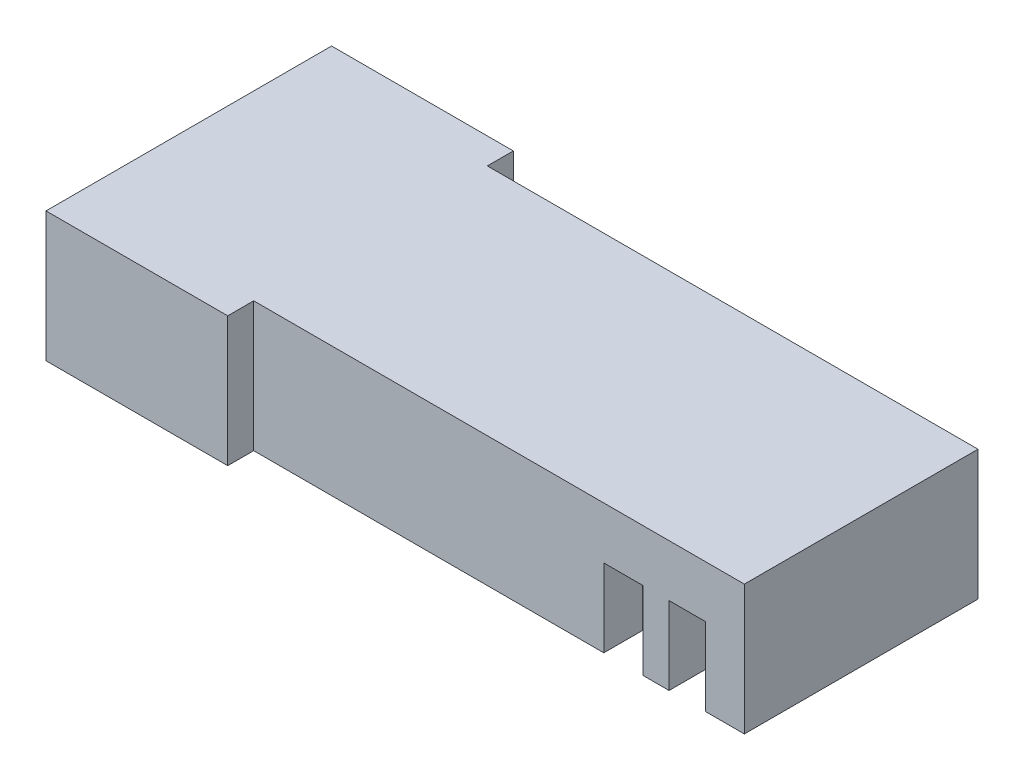
ISO-10303-21;
HEADER;
FILE_DESCRIPTION(('STEP AP214'),'2;1');
FILE_NAME('part.step','',(''),(''),'','','');
FILE_SCHEMA(('AUTOMOTIVE_DESIGN { 1 0 10303 214 1 1 1 1 }'));
ENDSEC;
DATA;
#1=APPLICATION_CONTEXT('core data for automotive mechanical design processes');
#2=APPLICATION_PROTOCOL_DEFINITION('international standard','automotive_design',2000,#1);
#3=PRODUCT_CONTEXT('',#1,'mechanical');
#4=PRODUCT('Part','Part','',(#3));
#5=PRODUCT_RELATED_PRODUCT_CATEGORY('part','',(#4));
#6=PRODUCT_DEFINITION_FORMATION('','',#4);
#7=PRODUCT_DEFINITION_CONTEXT('part definition',#1,'design');
#8=PRODUCT_DEFINITION('design','',#6,#7);
#9=PRODUCT_DEFINITION_SHAPE('','',#8);
#10=(LENGTH_UNIT() NAMED_UNIT(*) SI_UNIT(.MILLI.,.METRE.));
#11=(NAMED_UNIT(*) PLANE_ANGLE_UNIT() SI_UNIT($,.RADIAN.));
#12=(NAMED_UNIT(*) SI_UNIT($,.STERADIAN.) SOLID_ANGLE_UNIT());
#13=UNCERTAINTY_MEASURE_WITH_UNIT(LENGTH_MEASURE(1.E-05),#10,'distance_accuracy_value','');
#14=(GEOMETRIC_REPRESENTATION_CONTEXT(3) GLOBAL_UNCERTAINTY_ASSIGNED_CONTEXT((#13)) GLOBAL_UNIT_ASSIGNED_CONTEXT((#10,
#11,#12)) REPRESENTATION_CONTEXT('',''));
#15=CARTESIAN_POINT('',(0.,0.,0.));
#16=DIRECTION('',(0.,0.,1.));
#17=DIRECTION('',(1.,0.,0.));
#18=AXIS2_PLACEMENT_3D('',#15,#16,#17);
#19=CARTESIAN_POINT('',(0.,0.,0.));
#20=DIRECTION('',(0.,-1.,0.));
#21=DIRECTION('',(0.,0.,-1.));
#22=AXIS2_PLACEMENT_3D('',#19,#20,#21);
#23=PLANE('',#22);
#24=DIRECTION('',(0.,0.,-1.));
#25=VECTOR('',#24,1.);
#26=CARTESIAN_POINT('',(8.5,0.,-1.6));
#27=LINE('',#26,#25);
#28=CARTESIAN_POINT('',(8.5,0.,4.5));
#29=VERTEX_POINT('',#28);
#30=CARTESIAN_POINT('',(8.5,0.,-1.6));
#31=VERTEX_POINT('',#30);
#32=EDGE_CURVE('E312',#29,#31,#27,.T.);
#33=ORIENTED_EDGE('',*,*,#32,.T.);
#34=DIRECTION('',(-1.,0.,0.));
#35=VECTOR('',#34,1.);
#36=CARTESIAN_POINT('',(0.5,0.,-1.6));
#37=LINE('',#36,#35);
#38=CARTESIAN_POINT('',(0.5,0.,-1.6));
#39=VERTEX_POINT('',#38);
#40=EDGE_CURVE('E289',#31,#39,#37,.T.);
#41=ORIENTED_EDGE('',*,*,#40,.T.);
#42=DIRECTION('',(0.,0.,1.));
#43=VECTOR('',#42,1.);
#44=CARTESIAN_POINT('',(0.5,0.,1.6));
#45=LINE('',#44,#43);
#46=CARTESIAN_POINT('',(0.5,0.,1.6));
#47=VERTEX_POINT('',#46);
#48=EDGE_CURVE('E284',#39,#47,#45,.T.);
#49=ORIENTED_EDGE('',*,*,#48,.T.);
#50=DIRECTION('',(1.,0.,0.));
#51=VECTOR('',#50,1.);
#52=CARTESIAN_POINT('',(7.5,0.,1.6));
#53=LINE('',#52,#51);
#54=CARTESIAN_POINT('',(7.5,0.,1.6));
#55=VERTEX_POINT('',#54);
#56=EDGE_CURVE('E306',#47,#55,#53,.T.);
#57=ORIENTED_EDGE('',*,*,#56,.T.);
#58=DIRECTION('',(0.,0.,1.));
#59=VECTOR('',#58,1.);
#60=CARTESIAN_POINT('',(7.5,0.,4.5));
#61=LINE('',#60,#59);
#62=CARTESIAN_POINT('',(7.5,0.,4.5));
#63=VERTEX_POINT('',#62);
#64=EDGE_CURVE('E309',#55,#63,#61,.T.);
#65=ORIENTED_EDGE('',*,*,#64,.T.);
#66=DIRECTION('',(1.,0.,0.));
#67=VECTOR('',#66,1.);
#68=CARTESIAN_POINT('',(11.4,0.,4.5));
#69=LINE('',#68,#67);
#70=CARTESIAN_POINT('',(5.98615735461801,0.,4.5));
#71=VERTEX_POINT('',#70);
#72=EDGE_CURVE('E430',#71,#63,#69,.T.);
#73=ORIENTED_EDGE('',*,*,#72,.F.);
#74=DIRECTION('',(0.,0.,-1.));
#75=VECTOR('',#74,1.);
#76=CARTESIAN_POINT('',(5.98615735461801,0.,4.5));
#77=LINE('',#76,#75);
#78=CARTESIAN_POINT('',(5.98615735461801,0.,3.));
#79=VERTEX_POINT('',#78);
#80=EDGE_CURVE('E319',#71,#79,#77,.T.);
#81=ORIENTED_EDGE('',*,*,#80,.T.);
#82=DIRECTION('',(-1.,0.,0.));
#83=VECTOR('',#82,1.);
#84=CARTESIAN_POINT('',(5.98615735461801,0.,3.));
#85=LINE('',#84,#83);
#86=CARTESIAN_POINT('',(0.5,0.,3.));
#87=VERTEX_POINT('',#86);
#88=EDGE_CURVE('E358',#79,#87,#85,.T.);
#89=ORIENTED_EDGE('',*,*,#88,.T.);
#90=DIRECTION('',(0.,0.,1.));
#91=VECTOR('',#90,1.);
#92=CARTESIAN_POINT('',(0.5,0.,3.5));
#93=LINE('',#92,#91);
#94=CARTESIAN_POINT('',(0.5,0.,3.5));
#95=VERTEX_POINT('',#94);
#96=EDGE_CURVE('E361',#87,#95,#93,.T.);
#97=ORIENTED_EDGE('',*,*,#96,.T.);
#98=DIRECTION('',(-1.,0.,0.));
#99=VECTOR('',#98,1.);
#100=CARTESIAN_POINT('',(-14.5,0.,3.5));
#101=LINE('',#100,#99);
#102=CARTESIAN_POINT('',(-14.5,0.,3.5));
#103=VERTEX_POINT('',#102);
#104=EDGE_CURVE('E335',#95,#103,#101,.T.);
#105=ORIENTED_EDGE('',*,*,#104,.T.);
#106=DIRECTION('',(0.,0.,1.));
#107=VECTOR('',#106,1.);
#108=CARTESIAN_POINT('',(-14.5,0.,-5.5));
#109=LINE('',#108,#107);
#110=CARTESIAN_POINT('',(-14.5,0.,-3.5));
#111=VERTEX_POINT('',#110);
#112=EDGE_CURVE('E418',#111,#103,#109,.T.);
#113=ORIENTED_EDGE('',*,*,#112,.F.);
#114=DIRECTION('',(1.,0.,0.));
#115=VECTOR('',#114,1.);
#116=CARTESIAN_POINT('',(-14.5,0.,-3.5));
#117=LINE('',#116,#115);
#118=CARTESIAN_POINT('',(0.499999999999999,0.,-3.5));
#119=VERTEX_POINT('',#118);
#120=EDGE_CURVE('E369',#111,#119,#117,.T.);
#121=ORIENTED_EDGE('',*,*,#120,.T.);
#122=DIRECTION('',(0.,0.,1.));
#123=VECTOR('',#122,1.);
#124=CARTESIAN_POINT('',(0.499999999999999,0.,-3.5));
#125=LINE('',#124,#123);
#126=CARTESIAN_POINT('',(0.5,0.,-3.));
#127=VERTEX_POINT('',#126);
#128=EDGE_CURVE('E407',#119,#127,#125,.T.);
#129=ORIENTED_EDGE('',*,*,#128,.T.);
#130=DIRECTION('',(1.,0.,0.));
#131=VECTOR('',#130,1.);
#132=CARTESIAN_POINT('',(7.5,0.,-3.));
#133=LINE('',#132,#131);
#134=CARTESIAN_POINT('',(9.9,0.,-3.));
#135=VERTEX_POINT('',#134);
#136=EDGE_CURVE('E410',#127,#135,#133,.T.);
#137=ORIENTED_EDGE('',*,*,#136,.T.);
#138=DIRECTION('',(0.,0.,1.));
#139=VECTOR('',#138,1.);
#140=CARTESIAN_POINT('',(9.9,0.,-3.));
#141=LINE('',#140,#139);
#142=CARTESIAN_POINT('',(9.9,0.,4.5));
#143=VERTEX_POINT('',#142);
#144=EDGE_CURVE('E381',#135,#143,#141,.T.);
#145=ORIENTED_EDGE('',*,*,#144,.T.);
#146=EDGE_CURVE('E447',#29,#143,#69,.T.);
#147=ORIENTED_EDGE('',*,*,#146,.F.);
#148=EDGE_LOOP('',(#33,#41,#49,#57,#65,#73,#81,#89,#97,#105,#113,#121,#129,#137,#145,#147));
#149=FACE_BOUND('',#148,.T.);
#150=ADVANCED_FACE('F37',(#149),#23,.T.);
#151=CARTESIAN_POINT('',(-7.5,2.,-4.5));
#152=DIRECTION('',(0.,0.,1.));
#153=DIRECTION('',(1.,0.,0.));
#154=AXIS2_PLACEMENT_3D('',#151,#152,#153);
#155=PLANE('',#154);
#156=DIRECTION('',(0.,-1.,0.));
#157=VECTOR('',#156,1.);
#158=CARTESIAN_POINT('',(11.4,2.,-4.5));
#159=LINE('',#158,#157);
#160=CARTESIAN_POINT('',(11.4,2.,-4.5));
#161=VERTEX_POINT('',#160);
#162=CARTESIAN_POINT('',(11.4,-3.,-4.5));
#163=VERTEX_POINT('',#162);
#164=EDGE_CURVE('E444',#161,#163,#159,.T.);
#165=ORIENTED_EDGE('',*,*,#164,.T.);
#166=DIRECTION('',(-1.,0.,0.));
#167=VECTOR('',#166,1.);
#168=CARTESIAN_POINT('',(11.4,-3.,-4.5));
#169=LINE('',#168,#167);
#170=CARTESIAN_POINT('',(-7.5,-3.,-4.5));
#171=VERTEX_POINT('',#170);
#172=EDGE_CURVE('E377',#163,#171,#169,.T.);
#173=ORIENTED_EDGE('',*,*,#172,.T.);
#174=DIRECTION('',(0.,-1.,0.));
#175=VECTOR('',#174,1.);
#176=CARTESIAN_POINT('',(-7.5,2.,-4.5));
#177=LINE('',#176,#175);
#178=CARTESIAN_POINT('',(-7.5,2.,-4.5));
#179=VERTEX_POINT('',#178);
#180=EDGE_CURVE('E463',#179,#171,#177,.T.);
#181=ORIENTED_EDGE('',*,*,#180,.F.);
#182=DIRECTION('',(-1.,0.,0.));
#183=VECTOR('',#182,1.);
#184=CARTESIAN_POINT('',(7.5,2.,-4.5));
#185=LINE('',#184,#183);
#186=EDGE_CURVE('E427',#161,#179,#185,.T.);
#187=ORIENTED_EDGE('',*,*,#186,.F.);
#188=EDGE_LOOP('',(#165,#173,#181,#187));
#189=FACE_BOUND('',#188,.T.);
#190=ADVANCED_FACE('F39',(#189),#155,.F.);
#191=CARTESIAN_POINT('',(-7.5,2.,-4.5));
#192=DIRECTION('',(-1.,0.,0.));
#193=DIRECTION('',(0.,0.,1.));
#194=AXIS2_PLACEMENT_3D('',#191,#192,#193);
#195=PLANE('',#194);
#196=DIRECTION('',(0.,0.,-1.));
#197=VECTOR('',#196,1.);
#198=CARTESIAN_POINT('',(-7.5,-3.,-4.5));
#199=LINE('',#198,#197);
#200=CARTESIAN_POINT('',(-7.5,-3.,-5.5));
#201=VERTEX_POINT('',#200);
#202=EDGE_CURVE('E380',#171,#201,#199,.T.);
#203=ORIENTED_EDGE('',*,*,#202,.T.);
#204=DIRECTION('',(0.,-1.,0.));
#205=VECTOR('',#204,1.);
#206=CARTESIAN_POINT('',(-7.5,2.,-5.5));
#207=LINE('',#206,#205);
#208=CARTESIAN_POINT('',(-7.5,2.,-5.5));
#209=VERTEX_POINT('',#208);
#210=EDGE_CURVE('E461',#209,#201,#207,.T.);
#211=ORIENTED_EDGE('',*,*,#210,.F.);
#212=DIRECTION('',(0.,0.,-1.));
#213=VECTOR('',#212,1.);
#214=CARTESIAN_POINT('',(-7.5,2.,-4.5));
#215=LINE('',#214,#213);
#216=EDGE_CURVE('E429',#179,#209,#215,.T.);
#217=ORIENTED_EDGE('',*,*,#216,.F.);
#218=ORIENTED_EDGE('',*,*,#180,.T.);
#219=EDGE_LOOP('',(#203,#211,#217,#218));
#220=FACE_BOUND('',#219,.T.);
#221=ADVANCED_FACE('F509',(#220),#195,.F.);
#222=CARTESIAN_POINT('',(-7.5,2.,-5.5));
#223=DIRECTION('',(0.,0.,1.));
#224=DIRECTION('',(1.,0.,0.));
#225=AXIS2_PLACEMENT_3D('',#222,#223,#224);
#226=PLANE('',#225);
#227=DIRECTION('',(-1.,0.,0.));
#228=VECTOR('',#227,1.);
#229=CARTESIAN_POINT('',(-7.5,-3.,-5.5));
#230=LINE('',#229,#228);
#231=CARTESIAN_POINT('',(-14.5,-3.,-5.5));
#232=VERTEX_POINT('',#231);
#233=EDGE_CURVE('E384',#201,#232,#230,.T.);
#234=ORIENTED_EDGE('',*,*,#233,.T.);
#235=DIRECTION('',(0.,-1.,0.));
#236=VECTOR('',#235,1.);
#237=CARTESIAN_POINT('',(-14.5,2.,-5.5));
#238=LINE('',#237,#236);
#239=CARTESIAN_POINT('',(-14.5,2.,-5.5));
#240=VERTEX_POINT('',#239);
#241=EDGE_CURVE('E459',#240,#232,#238,.T.);
#242=ORIENTED_EDGE('',*,*,#241,.F.);
#243=DIRECTION('',(-1.,0.,0.));
#244=VECTOR('',#243,1.);
#245=CARTESIAN_POINT('',(-7.5,2.,-5.5));
#246=LINE('',#245,#244);
#247=EDGE_CURVE('E432',#209,#240,#246,.T.);
#248=ORIENTED_EDGE('',*,*,#247,.F.);
#249=ORIENTED_EDGE('',*,*,#210,.T.);
#250=EDGE_LOOP('',(#234,#242,#248,#249));
#251=FACE_BOUND('',#250,.T.);
#252=ADVANCED_FACE('F505',(#251),#226,.F.);
#253=CARTESIAN_POINT('',(-14.5,2.,-5.5));
#254=DIRECTION('',(1.,0.,0.));
#255=DIRECTION('',(0.,0.,-1.));
#256=AXIS2_PLACEMENT_3D('',#253,#254,#255);
#257=PLANE('',#256);
#258=DIRECTION('',(0.,0.,1.));
#259=VECTOR('',#258,1.);
#260=CARTESIAN_POINT('',(-14.5,-3.,-5.5));
#261=LINE('',#260,#259);
#262=CARTESIAN_POINT('',(-14.5,-3.,-2.39113648292669));
#263=VERTEX_POINT('',#262);
#264=EDGE_CURVE('E387',#232,#263,#261,.T.);
#265=ORIENTED_EDGE('',*,*,#264,.T.);
#266=DIRECTION('',(0.,-1.,0.));
#267=VECTOR('',#266,1.);
#268=CARTESIAN_POINT('',(-14.5,-1.,-2.39113648292669));
#269=LINE('',#268,#267);
#270=CARTESIAN_POINT('',(-14.5,-1.,-2.39113648292669));
#271=VERTEX_POINT('',#270);
#272=EDGE_CURVE('E248',#271,#263,#269,.T.);
#273=ORIENTED_EDGE('',*,*,#272,.F.);
#274=DIRECTION('',(0.,0.,-1.));
#275=VECTOR('',#274,1.);
#276=CARTESIAN_POINT('',(-14.5,-1.,-5.5));
#277=LINE('',#276,#275);
#278=CARTESIAN_POINT('',(-14.5,-1.,-3.5));
#279=VERTEX_POINT('',#278);
#280=EDGE_CURVE('E249',#271,#279,#277,.T.);
#281=ORIENTED_EDGE('',*,*,#280,.T.);
#282=DIRECTION('',(0.,1.,0.));
#283=VECTOR('',#282,1.);
#284=CARTESIAN_POINT('',(-14.5,-3.,-3.5));
#285=LINE('',#284,#283);
#286=EDGE_CURVE('E55',#279,#111,#285,.T.);
#287=ORIENTED_EDGE('',*,*,#286,.T.);
#288=ORIENTED_EDGE('',*,*,#112,.T.);
#289=DIRECTION('',(0.,1.,0.));
#290=VECTOR('',#289,1.);
#291=CARTESIAN_POINT('',(-14.5,-3.,3.5));
#292=LINE('',#291,#290);
#293=CARTESIAN_POINT('',(-14.5,-1.,3.5));
#294=VERTEX_POINT('',#293);
#295=EDGE_CURVE('E370',#294,#103,#292,.T.);
#296=ORIENTED_EDGE('',*,*,#295,.F.);
#297=DIRECTION('',(0.,0.,-1.));
#298=VECTOR('',#297,1.);
#299=CARTESIAN_POINT('',(-14.5,-1.,5.5));
#300=LINE('',#299,#298);
#301=CARTESIAN_POINT('',(-14.5,-1.,2.39113648292669));
#302=VERTEX_POINT('',#301);
#303=EDGE_CURVE('E263',#294,#302,#300,.T.);
#304=ORIENTED_EDGE('',*,*,#303,.T.);
#305=DIRECTION('',(0.,-1.,0.));
#306=VECTOR('',#305,1.);
#307=CARTESIAN_POINT('',(-14.5,-1.,2.39113648292669));
#308=LINE('',#307,#306);
#309=CARTESIAN_POINT('',(-14.5,-3.,2.39113648292669));
#310=VERTEX_POINT('',#309);
#311=EDGE_CURVE('E272',#302,#310,#308,.T.);
#312=ORIENTED_EDGE('',*,*,#311,.T.);
#313=DIRECTION('',(0.,0.,1.));
#314=VECTOR('',#313,1.);
#315=CARTESIAN_POINT('',(-14.5,-3.,5.5));
#316=LINE('',#315,#314);
#317=CARTESIAN_POINT('',(-14.5,-3.,5.5));
#318=VERTEX_POINT('',#317);
#319=EDGE_CURVE('E343',#310,#318,#316,.T.);
#320=ORIENTED_EDGE('',*,*,#319,.T.);
#321=DIRECTION('',(0.,-1.,0.));
#322=VECTOR('',#321,1.);
#323=CARTESIAN_POINT('',(-14.5,2.,5.5));
#324=LINE('',#323,#322);
#325=CARTESIAN_POINT('',(-14.5,2.,5.5));
#326=VERTEX_POINT('',#325);
#327=EDGE_CURVE('E457',#326,#318,#324,.T.);
#328=ORIENTED_EDGE('',*,*,#327,.F.);
#329=DIRECTION('',(0.,0.,1.));
#330=VECTOR('',#329,1.);
#331=CARTESIAN_POINT('',(-14.5,2.,-5.5));
#332=LINE('',#331,#330);
#333=EDGE_CURVE('E434',#240,#326,#332,.T.);
#334=ORIENTED_EDGE('',*,*,#333,.F.);
#335=ORIENTED_EDGE('',*,*,#241,.T.);
#336=EDGE_LOOP('',(#265,#273,#281,#287,#288,#296,#304,#312,#320,#328,#334,#335));
#337=FACE_BOUND('',#336,.T.);
#338=ADVANCED_FACE('F473',(#337),#257,.F.);
#339=CARTESIAN_POINT('',(-14.5,2.,5.5));
#340=DIRECTION('',(0.,0.,-1.));
#341=DIRECTION('',(-1.,0.,0.));
#342=AXIS2_PLACEMENT_3D('',#339,#340,#341);
#343=PLANE('',#342);
#344=DIRECTION('',(1.,0.,0.));
#345=VECTOR('',#344,1.);
#346=CARTESIAN_POINT('',(-7.5,-3.,5.5));
#347=LINE('',#346,#345);
#348=CARTESIAN_POINT('',(-7.5,-3.,5.5));
#349=VERTEX_POINT('',#348);
#350=EDGE_CURVE('E346',#318,#349,#347,.T.);
#351=ORIENTED_EDGE('',*,*,#350,.T.);
#352=DIRECTION('',(0.,-1.,0.));
#353=VECTOR('',#352,1.);
#354=CARTESIAN_POINT('',(-7.5,2.,5.5));
#355=LINE('',#354,#353);
#356=CARTESIAN_POINT('',(-7.5,2.,5.5));
#357=VERTEX_POINT('',#356);
#358=EDGE_CURVE('E455',#357,#349,#355,.T.);
#359=ORIENTED_EDGE('',*,*,#358,.F.);
#360=DIRECTION('',(1.,0.,0.));
#361=VECTOR('',#360,1.);
#362=CARTESIAN_POINT('',(-14.5,2.,5.5));
#363=LINE('',#362,#361);
#364=EDGE_CURVE('E436',#326,#357,#363,.T.);
#365=ORIENTED_EDGE('',*,*,#364,.F.);
#366=ORIENTED_EDGE('',*,*,#327,.T.);
#367=EDGE_LOOP('',(#351,#359,#365,#366));
#368=FACE_BOUND('',#367,.T.);
#369=ADVANCED_FACE('F492',(#368),#343,.F.);
#370=CARTESIAN_POINT('',(-7.5,2.,5.5));
#371=DIRECTION('',(-1.,0.,0.));
#372=DIRECTION('',(0.,0.,1.));
#373=AXIS2_PLACEMENT_3D('',#370,#371,#372);
#374=PLANE('',#373);
#375=DIRECTION('',(0.,0.,-1.));
#376=VECTOR('',#375,1.);
#377=CARTESIAN_POINT('',(-7.5,-3.,4.5));
#378=LINE('',#377,#376);
#379=CARTESIAN_POINT('',(-7.5,-3.,4.5));
#380=VERTEX_POINT('',#379);
#381=EDGE_CURVE('E349',#349,#380,#378,.T.);
#382=ORIENTED_EDGE('',*,*,#381,.T.);
#383=DIRECTION('',(0.,-1.,0.));
#384=VECTOR('',#383,1.);
#385=CARTESIAN_POINT('',(-7.5,2.,4.5));
#386=LINE('',#385,#384);
#387=CARTESIAN_POINT('',(-7.5,2.,4.5));
#388=VERTEX_POINT('',#387);
#389=EDGE_CURVE('E453',#388,#380,#386,.T.);
#390=ORIENTED_EDGE('',*,*,#389,.F.);
#391=DIRECTION('',(0.,0.,-1.));
#392=VECTOR('',#391,1.);
#393=CARTESIAN_POINT('',(-7.5,2.,5.5));
#394=LINE('',#393,#392);
#395=EDGE_CURVE('E438',#357,#388,#394,.T.);
#396=ORIENTED_EDGE('',*,*,#395,.F.);
#397=ORIENTED_EDGE('',*,*,#358,.T.);
#398=EDGE_LOOP('',(#382,#390,#396,#397));
#399=FACE_BOUND('',#398,.T.);
#400=ADVANCED_FACE('F597',(#399),#374,.F.);
#401=CARTESIAN_POINT('',(11.4,2.,4.5));
#402=DIRECTION('',(0.,0.,-1.));
#403=DIRECTION('',(-1.,0.,0.));
#404=AXIS2_PLACEMENT_3D('',#401,#402,#403);
#405=PLANE('',#404);
#406=ORIENTED_EDGE('',*,*,#389,.T.);
#407=DIRECTION('',(1.,0.,0.));
#408=VECTOR('',#407,1.);
#409=CARTESIAN_POINT('',(-7.5,-3.,4.5));
#410=LINE('',#409,#408);
#411=CARTESIAN_POINT('',(5.98615735461801,-3.,4.5));
#412=VERTEX_POINT('',#411);
#413=EDGE_CURVE('E352',#380,#412,#410,.T.);
#414=ORIENTED_EDGE('',*,*,#413,.T.);
#415=DIRECTION('',(0.,1.,0.));
#416=VECTOR('',#415,1.);
#417=CARTESIAN_POINT('',(5.98615735461801,-3.,4.5));
#418=LINE('',#417,#416);
#419=EDGE_CURVE('E366',#412,#71,#418,.T.);
#420=ORIENTED_EDGE('',*,*,#419,.T.);
#421=ORIENTED_EDGE('',*,*,#72,.T.);
#422=DIRECTION('',(0.,1.,0.));
#423=VECTOR('',#422,1.);
#424=CARTESIAN_POINT('',(7.5,-3.,4.5));
#425=LINE('',#424,#423);
#426=CARTESIAN_POINT('',(7.5,-3.,4.5));
#427=VERTEX_POINT('',#426);
#428=EDGE_CURVE('E326',#427,#63,#425,.T.);
#429=ORIENTED_EDGE('',*,*,#428,.F.);
#430=DIRECTION('',(1.,0.,0.));
#431=VECTOR('',#430,1.);
#432=CARTESIAN_POINT('',(8.5,-3.,4.5));
#433=LINE('',#432,#431);
#434=CARTESIAN_POINT('',(8.5,-3.,4.5));
#435=VERTEX_POINT('',#434);
#436=EDGE_CURVE('E295',#427,#435,#433,.T.);
#437=ORIENTED_EDGE('',*,*,#436,.T.);
#438=DIRECTION('',(0.,1.,0.));
#439=VECTOR('',#438,1.);
#440=CARTESIAN_POINT('',(8.5,-3.,4.5));
#441=LINE('',#440,#439);
#442=EDGE_CURVE('E323',#435,#29,#441,.T.);
#443=ORIENTED_EDGE('',*,*,#442,.T.);
#444=ORIENTED_EDGE('',*,*,#146,.T.);
#445=DIRECTION('',(0.,1.,0.));
#446=VECTOR('',#445,1.);
#447=CARTESIAN_POINT('',(9.9,-3.,4.5));
#448=LINE('',#447,#446);
#449=CARTESIAN_POINT('',(9.9,-3.,4.5));
#450=VERTEX_POINT('',#449);
#451=EDGE_CURVE('E415',#450,#143,#448,.T.);
#452=ORIENTED_EDGE('',*,*,#451,.F.);
#453=DIRECTION('',(1.,0.,0.));
#454=VECTOR('',#453,1.);
#455=CARTESIAN_POINT('',(9.9,-3.,4.5));
#456=LINE('',#455,#454);
#457=CARTESIAN_POINT('',(11.4,-3.,4.5));
#458=VERTEX_POINT('',#457);
#459=EDGE_CURVE('E399',#450,#458,#456,.T.);
#460=ORIENTED_EDGE('',*,*,#459,.T.);
#461=DIRECTION('',(0.,-1.,0.));
#462=VECTOR('',#461,1.);
#463=CARTESIAN_POINT('',(11.4,2.,4.5));
#464=LINE('',#463,#462);
#465=CARTESIAN_POINT('',(11.4,2.,4.5));
#466=VERTEX_POINT('',#465);
#467=EDGE_CURVE('E451',#466,#458,#464,.T.);
#468=ORIENTED_EDGE('',*,*,#467,.F.);
#469=DIRECTION('',(1.,0.,0.));
#470=VECTOR('',#469,1.);
#471=CARTESIAN_POINT('',(-7.5,2.,4.5));
#472=LINE('',#471,#470);
#473=EDGE_CURVE('E440',#388,#466,#472,.T.);
#474=ORIENTED_EDGE('',*,*,#473,.F.);
#475=EDGE_LOOP('',(#406,#414,#420,#421,#429,#437,#443,#444,#452,#460,#468,#474));
#476=FACE_BOUND('',#475,.T.);
#477=ADVANCED_FACE('F523',(#476),#405,.F.);
#478=CARTESIAN_POINT('',(11.4,2.,-4.5));
#479=DIRECTION('',(-1.,0.,0.));
#480=DIRECTION('',(0.,0.,1.));
#481=AXIS2_PLACEMENT_3D('',#478,#479,#480);
#482=PLANE('',#481);
#483=ORIENTED_EDGE('',*,*,#467,.T.);
#484=DIRECTION('',(0.,0.,-1.));
#485=VECTOR('',#484,1.);
#486=CARTESIAN_POINT('',(11.4,-3.,4.5));
#487=LINE('',#486,#485);
#488=EDGE_CURVE('E402',#458,#163,#487,.T.);
#489=ORIENTED_EDGE('',*,*,#488,.T.);
#490=ORIENTED_EDGE('',*,*,#164,.F.);
#491=DIRECTION('',(0.,0.,-1.));
#492=VECTOR('',#491,1.);
#493=CARTESIAN_POINT('',(11.4,2.,-4.5));
#494=LINE('',#493,#492);
#495=EDGE_CURVE('E442',#466,#161,#494,.T.);
#496=ORIENTED_EDGE('',*,*,#495,.F.);
#497=EDGE_LOOP('',(#483,#489,#490,#496));
#498=FACE_BOUND('',#497,.T.);
#499=ADVANCED_FACE('F517',(#498),#482,.F.);
#500=CARTESIAN_POINT('',(0.,2.,0.));
#501=DIRECTION('',(0.,-1.,0.));
#502=DIRECTION('',(0.,0.,-1.));
#503=AXIS2_PLACEMENT_3D('',#500,#501,#502);
#504=PLANE('',#503);
#505=ORIENTED_EDGE('',*,*,#186,.T.);
#506=ORIENTED_EDGE('',*,*,#216,.T.);
#507=ORIENTED_EDGE('',*,*,#247,.T.);
#508=ORIENTED_EDGE('',*,*,#333,.T.);
#509=ORIENTED_EDGE('',*,*,#364,.T.);
#510=ORIENTED_EDGE('',*,*,#395,.T.);
#511=ORIENTED_EDGE('',*,*,#473,.T.);
#512=ORIENTED_EDGE('',*,*,#495,.T.);
#513=EDGE_LOOP('',(#505,#506,#507,#508,#509,#510,#511,#512));
#514=FACE_BOUND('',#513,.T.);
#515=ADVANCED_FACE('F495',(#514),#504,.F.);
#516=CARTESIAN_POINT('',(9.9,-3.,-3.));
#517=DIRECTION('',(-1.,0.,0.));
#518=DIRECTION('',(0.,0.,1.));
#519=AXIS2_PLACEMENT_3D('',#516,#517,#518);
#520=PLANE('',#519);
#521=ORIENTED_EDGE('',*,*,#144,.F.);
#522=DIRECTION('',(0.,1.,0.));
#523=VECTOR('',#522,1.);
#524=CARTESIAN_POINT('',(9.9,-3.,-3.));
#525=LINE('',#524,#523);
#526=CARTESIAN_POINT('',(9.9,-3.,-3.));
#527=VERTEX_POINT('',#526);
#528=EDGE_CURVE('E419',#527,#135,#525,.T.);
#529=ORIENTED_EDGE('',*,*,#528,.F.);
#530=DIRECTION('',(0.,0.,1.));
#531=VECTOR('',#530,1.);
#532=CARTESIAN_POINT('',(9.9,-3.,-3.));
#533=LINE('',#532,#531);
#534=EDGE_CURVE('E396',#527,#450,#533,.T.);
#535=ORIENTED_EDGE('',*,*,#534,.T.);
#536=ORIENTED_EDGE('',*,*,#451,.T.);
#537=EDGE_LOOP('',(#521,#529,#535,#536));
#538=FACE_BOUND('',#537,.T.);
#539=ADVANCED_FACE('F529',(#538),#520,.T.);
#540=CARTESIAN_POINT('',(7.5,-3.,-3.));
#541=DIRECTION('',(0.,0.,1.));
#542=DIRECTION('',(1.,0.,0.));
#543=AXIS2_PLACEMENT_3D('',#540,#541,#542);
#544=PLANE('',#543);
#545=ORIENTED_EDGE('',*,*,#136,.F.);
#546=DIRECTION('',(0.,1.,0.));
#547=VECTOR('',#546,1.);
#548=CARTESIAN_POINT('',(0.5,-3.,-3.));
#549=LINE('',#548,#547);
#550=CARTESIAN_POINT('',(0.5,-3.,-3.));
#551=VERTEX_POINT('',#550);
#552=EDGE_CURVE('E421',#551,#127,#549,.T.);
#553=ORIENTED_EDGE('',*,*,#552,.F.);
#554=DIRECTION('',(1.,0.,0.));
#555=VECTOR('',#554,1.);
#556=CARTESIAN_POINT('',(0.5,-3.,-3.));
#557=LINE('',#556,#555);
#558=EDGE_CURVE('E394',#551,#527,#557,.T.);
#559=ORIENTED_EDGE('',*,*,#558,.T.);
#560=ORIENTED_EDGE('',*,*,#528,.T.);
#561=EDGE_LOOP('',(#545,#553,#559,#560));
#562=FACE_BOUND('',#561,.T.);
#563=ADVANCED_FACE('F531',(#562),#544,.T.);
#564=CARTESIAN_POINT('',(0.499999999999999,-3.,-3.5));
#565=DIRECTION('',(-1.,0.,0.));
#566=DIRECTION('',(0.,0.,1.));
#567=AXIS2_PLACEMENT_3D('',#564,#565,#566);
#568=PLANE('',#567);
#569=ORIENTED_EDGE('',*,*,#128,.F.);
#570=DIRECTION('',(0.,1.,0.));
#571=VECTOR('',#570,1.);
#572=CARTESIAN_POINT('',(0.499999999999999,-3.,-3.5));
#573=LINE('',#572,#571);
#574=CARTESIAN_POINT('',(0.499999999999999,-3.,-3.5));
#575=VERTEX_POINT('',#574);
#576=EDGE_CURVE('E424',#575,#119,#573,.T.);
#577=ORIENTED_EDGE('',*,*,#576,.F.);
#578=DIRECTION('',(0.,0.,1.));
#579=VECTOR('',#578,1.);
#580=CARTESIAN_POINT('',(0.499999999999999,-3.,-3.5));
#581=LINE('',#580,#579);
#582=EDGE_CURVE('E391',#575,#551,#581,.T.);
#583=ORIENTED_EDGE('',*,*,#582,.T.);
#584=ORIENTED_EDGE('',*,*,#552,.T.);
#585=EDGE_LOOP('',(#569,#577,#583,#584));
#586=FACE_BOUND('',#585,.T.);
#587=ADVANCED_FACE('F536',(#586),#568,.T.);
#588=CARTESIAN_POINT('',(-14.5,-3.,-3.5));
#589=DIRECTION('',(0.,0.,1.));
#590=DIRECTION('',(1.,0.,0.));
#591=AXIS2_PLACEMENT_3D('',#588,#589,#590);
#592=PLANE('',#591);
#593=DIRECTION('',(0.,1.,0.));
#594=VECTOR('',#593,1.);
#595=CARTESIAN_POINT('',(-7.5,-3.,-3.5));
#596=LINE('',#595,#594);
#597=CARTESIAN_POINT('',(-7.5,-3.,-3.5));
#598=VERTEX_POINT('',#597);
#599=CARTESIAN_POINT('',(-7.5,-1.,-3.5));
#600=VERTEX_POINT('',#599);
#601=EDGE_CURVE('E237',#598,#600,#596,.T.);
#602=ORIENTED_EDGE('',*,*,#601,.F.);
#603=DIRECTION('',(1.,0.,0.));
#604=VECTOR('',#603,1.);
#605=CARTESIAN_POINT('',(-14.5,-3.,-3.5));
#606=LINE('',#605,#604);
#607=EDGE_CURVE('E389',#598,#575,#606,.T.);
#608=ORIENTED_EDGE('',*,*,#607,.T.);
#609=ORIENTED_EDGE('',*,*,#576,.T.);
#610=ORIENTED_EDGE('',*,*,#120,.F.);
#611=ORIENTED_EDGE('',*,*,#286,.F.);
#612=DIRECTION('',(1.,0.,0.));
#613=VECTOR('',#612,1.);
#614=CARTESIAN_POINT('',(-14.5,-1.,-3.5));
#615=LINE('',#614,#613);
#616=EDGE_CURVE('E11',#279,#600,#615,.T.);
#617=ORIENTED_EDGE('',*,*,#616,.T.);
#618=EDGE_LOOP('',(#602,#608,#609,#610,#611,#617));
#619=FACE_BOUND('',#618,.T.);
#620=ADVANCED_FACE('F537',(#619),#592,.T.);
#621=CARTESIAN_POINT('',(0.,-3.,0.));
#622=DIRECTION('',(0.,-1.,0.));
#623=DIRECTION('',(0.,0.,-1.));
#624=AXIS2_PLACEMENT_3D('',#621,#622,#623);
#625=PLANE('',#624);
#626=ORIENTED_EDGE('',*,*,#607,.F.);
#627=DIRECTION('',(0.,0.,1.));
#628=VECTOR('',#627,1.);
#629=CARTESIAN_POINT('',(-7.5,-3.,-5.5));
#630=LINE('',#629,#628);
#631=CARTESIAN_POINT('',(-7.5,-3.,-2.39113648292669));
#632=VERTEX_POINT('',#631);
#633=EDGE_CURVE('E257',#598,#632,#630,.T.);
#634=ORIENTED_EDGE('',*,*,#633,.T.);
#635=DIRECTION('',(-1.,0.,0.));
#636=VECTOR('',#635,1.);
#637=CARTESIAN_POINT('',(-7.5,-3.,-2.39113648292669));
#638=LINE('',#637,#636);
#639=EDGE_CURVE('E241',#632,#263,#638,.T.);
#640=ORIENTED_EDGE('',*,*,#639,.T.);
#641=ORIENTED_EDGE('',*,*,#264,.F.);
#642=ORIENTED_EDGE('',*,*,#233,.F.);
#643=ORIENTED_EDGE('',*,*,#202,.F.);
#644=ORIENTED_EDGE('',*,*,#172,.F.);
#645=ORIENTED_EDGE('',*,*,#488,.F.);
#646=ORIENTED_EDGE('',*,*,#459,.F.);
#647=ORIENTED_EDGE('',*,*,#534,.F.);
#648=ORIENTED_EDGE('',*,*,#558,.F.);
#649=ORIENTED_EDGE('',*,*,#582,.F.);
#650=EDGE_LOOP('',(#626,#634,#640,#641,#642,#643,#644,#645,#646,#647,#648,#649));
#651=FACE_BOUND('',#650,.T.);
#652=ADVANCED_FACE('F503',(#651),#625,.T.);
#653=CARTESIAN_POINT('',(5.98615735461801,-3.,4.5));
#654=DIRECTION('',(1.,0.,0.));
#655=DIRECTION('',(0.,0.,-1.));
#656=AXIS2_PLACEMENT_3D('',#653,#654,#655);
#657=PLANE('',#656);
#658=ORIENTED_EDGE('',*,*,#80,.F.);
#659=ORIENTED_EDGE('',*,*,#419,.F.);
#660=DIRECTION('',(0.,0.,-1.));
#661=VECTOR('',#660,1.);
#662=CARTESIAN_POINT('',(5.98615735461801,-3.,4.5));
#663=LINE('',#662,#661);
#664=CARTESIAN_POINT('',(5.98615735461801,-3.,3.));
#665=VERTEX_POINT('',#664);
#666=EDGE_CURVE('E331',#412,#665,#663,.T.);
#667=ORIENTED_EDGE('',*,*,#666,.T.);
#668=DIRECTION('',(0.,1.,0.));
#669=VECTOR('',#668,1.);
#670=CARTESIAN_POINT('',(5.98615735461801,-3.,3.));
#671=LINE('',#670,#669);
#672=EDGE_CURVE('E355',#665,#79,#671,.T.);
#673=ORIENTED_EDGE('',*,*,#672,.T.);
#674=EDGE_LOOP('',(#658,#659,#667,#673));
#675=FACE_BOUND('',#674,.T.);
#676=ADVANCED_FACE('F550',(#675),#657,.T.);
#677=CARTESIAN_POINT('',(-14.5,-3.,3.5));
#678=DIRECTION('',(0.,0.,-1.));
#679=DIRECTION('',(-1.,0.,0.));
#680=AXIS2_PLACEMENT_3D('',#677,#678,#679);
#681=PLANE('',#680);
#682=DIRECTION('',(0.,-1.,0.));
#683=VECTOR('',#682,1.);
#684=CARTESIAN_POINT('',(-7.5,-3.,3.5));
#685=LINE('',#684,#683);
#686=CARTESIAN_POINT('',(-7.5,-1.,3.5));
#687=VERTEX_POINT('',#686);
#688=CARTESIAN_POINT('',(-7.5,-3.,3.5));
#689=VERTEX_POINT('',#688);
#690=EDGE_CURVE('E279',#687,#689,#685,.T.);
#691=ORIENTED_EDGE('',*,*,#690,.F.);
#692=DIRECTION('',(-1.,0.,0.));
#693=VECTOR('',#692,1.);
#694=CARTESIAN_POINT('',(-14.5,-1.,3.5));
#695=LINE('',#694,#693);
#696=EDGE_CURVE('E45',#687,#294,#695,.T.);
#697=ORIENTED_EDGE('',*,*,#696,.T.);
#698=ORIENTED_EDGE('',*,*,#295,.T.);
#699=ORIENTED_EDGE('',*,*,#104,.F.);
#700=DIRECTION('',(0.,1.,0.));
#701=VECTOR('',#700,1.);
#702=CARTESIAN_POINT('',(0.5,-3.,3.5));
#703=LINE('',#702,#701);
#704=CARTESIAN_POINT('',(0.5,-3.,3.5));
#705=VERTEX_POINT('',#704);
#706=EDGE_CURVE('E372',#705,#95,#703,.T.);
#707=ORIENTED_EDGE('',*,*,#706,.F.);
#708=DIRECTION('',(-1.,0.,0.));
#709=VECTOR('',#708,1.);
#710=CARTESIAN_POINT('',(-14.5,-3.,3.5));
#711=LINE('',#710,#709);
#712=EDGE_CURVE('E341',#705,#689,#711,.T.);
#713=ORIENTED_EDGE('',*,*,#712,.T.);
#714=EDGE_LOOP('',(#691,#697,#698,#699,#707,#713));
#715=FACE_BOUND('',#714,.T.);
#716=ADVANCED_FACE('F467',(#715),#681,.T.);
#717=CARTESIAN_POINT('',(0.5,-3.,3.5));
#718=DIRECTION('',(-1.,0.,0.));
#719=DIRECTION('',(0.,0.,1.));
#720=AXIS2_PLACEMENT_3D('',#717,#718,#719);
#721=PLANE('',#720);
#722=ORIENTED_EDGE('',*,*,#96,.F.);
#723=DIRECTION('',(0.,1.,0.));
#724=VECTOR('',#723,1.);
#725=CARTESIAN_POINT('',(0.5,-3.,3.));
#726=LINE('',#725,#724);
#727=CARTESIAN_POINT('',(0.5,-3.,3.));
#728=VERTEX_POINT('',#727);
#729=EDGE_CURVE('E374',#728,#87,#726,.T.);
#730=ORIENTED_EDGE('',*,*,#729,.F.);
#731=DIRECTION('',(0.,0.,1.));
#732=VECTOR('',#731,1.);
#733=CARTESIAN_POINT('',(0.5,-3.,3.5));
#734=LINE('',#733,#732);
#735=EDGE_CURVE('E338',#728,#705,#734,.T.);
#736=ORIENTED_EDGE('',*,*,#735,.T.);
#737=ORIENTED_EDGE('',*,*,#706,.T.);
#738=EDGE_LOOP('',(#722,#730,#736,#737));
#739=FACE_BOUND('',#738,.T.);
#740=ADVANCED_FACE('F544',(#739),#721,.T.);
#741=CARTESIAN_POINT('',(5.98615735461801,-3.,3.));
#742=DIRECTION('',(0.,0.,-1.));
#743=DIRECTION('',(-1.,0.,0.));
#744=AXIS2_PLACEMENT_3D('',#741,#742,#743);
#745=PLANE('',#744);
#746=ORIENTED_EDGE('',*,*,#88,.F.);
#747=ORIENTED_EDGE('',*,*,#672,.F.);
#748=DIRECTION('',(-1.,0.,0.));
#749=VECTOR('',#748,1.);
#750=CARTESIAN_POINT('',(5.98615735461801,-3.,3.));
#751=LINE('',#750,#749);
#752=EDGE_CURVE('E334',#665,#728,#751,.T.);
#753=ORIENTED_EDGE('',*,*,#752,.T.);
#754=ORIENTED_EDGE('',*,*,#729,.T.);
#755=EDGE_LOOP('',(#746,#747,#753,#754));
#756=FACE_BOUND('',#755,.T.);
#757=ADVANCED_FACE('F547',(#756),#745,.T.);
#758=CARTESIAN_POINT('',(0.,-3.,0.));
#759=DIRECTION('',(0.,1.,0.));
#760=DIRECTION('',(0.,0.,1.));
#761=AXIS2_PLACEMENT_3D('',#758,#759,#760);
#762=PLANE('',#761);
#763=ORIENTED_EDGE('',*,*,#413,.F.);
#764=ORIENTED_EDGE('',*,*,#381,.F.);
#765=ORIENTED_EDGE('',*,*,#350,.F.);
#766=ORIENTED_EDGE('',*,*,#319,.F.);
#767=DIRECTION('',(1.,0.,0.));
#768=VECTOR('',#767,1.);
#769=CARTESIAN_POINT('',(-7.5,-3.,2.39113648292669));
#770=LINE('',#769,#768);
#771=CARTESIAN_POINT('',(-7.5,-3.,2.39113648292669));
#772=VERTEX_POINT('',#771);
#773=EDGE_CURVE('E262',#310,#772,#770,.T.);
#774=ORIENTED_EDGE('',*,*,#773,.T.);
#775=DIRECTION('',(0.,0.,1.));
#776=VECTOR('',#775,1.);
#777=CARTESIAN_POINT('',(-7.5,-3.,5.5));
#778=LINE('',#777,#776);
#779=EDGE_CURVE('E266',#772,#689,#778,.T.);
#780=ORIENTED_EDGE('',*,*,#779,.T.);
#781=ORIENTED_EDGE('',*,*,#712,.F.);
#782=ORIENTED_EDGE('',*,*,#735,.F.);
#783=ORIENTED_EDGE('',*,*,#752,.F.);
#784=ORIENTED_EDGE('',*,*,#666,.F.);
#785=EDGE_LOOP('',(#763,#764,#765,#766,#774,#780,#781,#782,#783,#784));
#786=FACE_BOUND('',#785,.T.);
#787=ADVANCED_FACE('F487',(#786),#762,.F.);
#788=CARTESIAN_POINT('',(0.5,-3.,1.6));
#789=DIRECTION('',(-1.,0.,0.));
#790=DIRECTION('',(0.,0.,1.));
#791=AXIS2_PLACEMENT_3D('',#788,#789,#790);
#792=PLANE('',#791);
#793=ORIENTED_EDGE('',*,*,#48,.F.);
#794=DIRECTION('',(0.,1.,0.));
#795=VECTOR('',#794,1.);
#796=CARTESIAN_POINT('',(0.5,-3.,-1.6));
#797=LINE('',#796,#795);
#798=CARTESIAN_POINT('',(0.5,-3.,-1.6));
#799=VERTEX_POINT('',#798);
#800=EDGE_CURVE('E317',#799,#39,#797,.T.);
#801=ORIENTED_EDGE('',*,*,#800,.F.);
#802=DIRECTION('',(0.,0.,1.));
#803=VECTOR('',#802,1.);
#804=CARTESIAN_POINT('',(0.5,-3.,1.6));
#805=LINE('',#804,#803);
#806=CARTESIAN_POINT('',(0.5,-3.,1.6));
#807=VERTEX_POINT('',#806);
#808=EDGE_CURVE('E285',#799,#807,#805,.T.);
#809=ORIENTED_EDGE('',*,*,#808,.T.);
#810=DIRECTION('',(0.,1.,0.));
#811=VECTOR('',#810,1.);
#812=CARTESIAN_POINT('',(0.5,-3.,1.6));
#813=LINE('',#812,#811);
#814=EDGE_CURVE('E303',#807,#47,#813,.T.);
#815=ORIENTED_EDGE('',*,*,#814,.T.);
#816=EDGE_LOOP('',(#793,#801,#809,#815));
#817=FACE_BOUND('',#816,.T.);
#818=ADVANCED_FACE('F572',(#817),#792,.T.);
#819=CARTESIAN_POINT('',(0.5,-3.,-1.6));
#820=DIRECTION('',(0.,0.,-1.));
#821=DIRECTION('',(-1.,0.,0.));
#822=AXIS2_PLACEMENT_3D('',#819,#820,#821);
#823=PLANE('',#822);
#824=ORIENTED_EDGE('',*,*,#40,.F.);
#825=DIRECTION('',(0.,1.,0.));
#826=VECTOR('',#825,1.);
#827=CARTESIAN_POINT('',(8.5,-3.,-1.6));
#828=LINE('',#827,#826);
#829=CARTESIAN_POINT('',(8.5,-3.,-1.6));
#830=VERTEX_POINT('',#829);
#831=EDGE_CURVE('E320',#830,#31,#828,.T.);
#832=ORIENTED_EDGE('',*,*,#831,.F.);
#833=DIRECTION('',(-1.,0.,0.));
#834=VECTOR('',#833,1.);
#835=CARTESIAN_POINT('',(7.5,-3.,-1.6));
#836=LINE('',#835,#834);
#837=EDGE_CURVE('E301',#830,#799,#836,.T.);
#838=ORIENTED_EDGE('',*,*,#837,.T.);
#839=ORIENTED_EDGE('',*,*,#800,.T.);
#840=EDGE_LOOP('',(#824,#832,#838,#839));
#841=FACE_BOUND('',#840,.T.);
#842=ADVANCED_FACE('F569',(#841),#823,.T.);
#843=CARTESIAN_POINT('',(8.5,-3.,-1.6));
#844=DIRECTION('',(1.,0.,0.));
#845=DIRECTION('',(0.,0.,-1.));
#846=AXIS2_PLACEMENT_3D('',#843,#844,#845);
#847=PLANE('',#846);
#848=ORIENTED_EDGE('',*,*,#32,.F.);
#849=ORIENTED_EDGE('',*,*,#442,.F.);
#850=DIRECTION('',(0.,0.,-1.));
#851=VECTOR('',#850,1.);
#852=CARTESIAN_POINT('',(8.5,-3.,-1.6));
#853=LINE('',#852,#851);
#854=EDGE_CURVE('E298',#435,#830,#853,.T.);
#855=ORIENTED_EDGE('',*,*,#854,.T.);
#856=ORIENTED_EDGE('',*,*,#831,.T.);
#857=EDGE_LOOP('',(#848,#849,#855,#856));
#858=FACE_BOUND('',#857,.T.);
#859=ADVANCED_FACE('F565',(#858),#847,.T.);
#860=CARTESIAN_POINT('',(7.5,-3.,4.5));
#861=DIRECTION('',(-1.,0.,0.));
#862=DIRECTION('',(0.,0.,1.));
#863=AXIS2_PLACEMENT_3D('',#860,#861,#862);
#864=PLANE('',#863);
#865=ORIENTED_EDGE('',*,*,#64,.F.);
#866=DIRECTION('',(0.,1.,0.));
#867=VECTOR('',#866,1.);
#868=CARTESIAN_POINT('',(7.5,-3.,1.6));
#869=LINE('',#868,#867);
#870=CARTESIAN_POINT('',(7.5,-3.,1.6));
#871=VERTEX_POINT('',#870);
#872=EDGE_CURVE('E328',#871,#55,#869,.T.);
#873=ORIENTED_EDGE('',*,*,#872,.F.);
#874=DIRECTION('',(0.,0.,1.));
#875=VECTOR('',#874,1.);
#876=CARTESIAN_POINT('',(7.5,-3.,4.5));
#877=LINE('',#876,#875);
#878=EDGE_CURVE('E292',#871,#427,#877,.T.);
#879=ORIENTED_EDGE('',*,*,#878,.T.);
#880=ORIENTED_EDGE('',*,*,#428,.T.);
#881=EDGE_LOOP('',(#865,#873,#879,#880));
#882=FACE_BOUND('',#881,.T.);
#883=ADVANCED_FACE('F555',(#882),#864,.T.);
#884=CARTESIAN_POINT('',(7.5,-3.,1.6));
#885=DIRECTION('',(0.,0.,1.));
#886=DIRECTION('',(1.,0.,0.));
#887=AXIS2_PLACEMENT_3D('',#884,#885,#886);
#888=PLANE('',#887);
#889=ORIENTED_EDGE('',*,*,#56,.F.);
#890=ORIENTED_EDGE('',*,*,#814,.F.);
#891=DIRECTION('',(1.,0.,0.));
#892=VECTOR('',#891,1.);
#893=CARTESIAN_POINT('',(7.5,-3.,1.6));
#894=LINE('',#893,#892);
#895=EDGE_CURVE('E288',#807,#871,#894,.T.);
#896=ORIENTED_EDGE('',*,*,#895,.T.);
#897=ORIENTED_EDGE('',*,*,#872,.T.);
#898=EDGE_LOOP('',(#889,#890,#896,#897));
#899=FACE_BOUND('',#898,.T.);
#900=ADVANCED_FACE('F574',(#899),#888,.T.);
#901=CARTESIAN_POINT('',(0.,-3.,0.));
#902=DIRECTION('',(0.,-1.,0.));
#903=DIRECTION('',(0.,0.,-1.));
#904=AXIS2_PLACEMENT_3D('',#901,#902,#903);
#905=PLANE('',#904);
#906=ORIENTED_EDGE('',*,*,#808,.F.);
#907=ORIENTED_EDGE('',*,*,#837,.F.);
#908=ORIENTED_EDGE('',*,*,#854,.F.);
#909=ORIENTED_EDGE('',*,*,#436,.F.);
#910=ORIENTED_EDGE('',*,*,#878,.F.);
#911=ORIENTED_EDGE('',*,*,#895,.F.);
#912=EDGE_LOOP('',(#906,#907,#908,#909,#910,#911));
#913=FACE_BOUND('',#912,.T.);
#914=ADVANCED_FACE('F561',(#913),#905,.T.);
#915=CARTESIAN_POINT('',(-7.5,-1.,5.5));
#916=DIRECTION('',(1.,0.,0.));
#917=DIRECTION('',(0.,0.,-1.));
#918=AXIS2_PLACEMENT_3D('',#915,#916,#917);
#919=PLANE('',#918);
#920=DIRECTION('',(0.,0.,1.));
#921=VECTOR('',#920,1.);
#922=CARTESIAN_POINT('',(-7.5,-1.,5.5));
#923=LINE('',#922,#921);
#924=CARTESIAN_POINT('',(-7.5,-1.,2.39113648292669));
#925=VERTEX_POINT('',#924);
#926=EDGE_CURVE('E269',#925,#687,#923,.T.);
#927=ORIENTED_EDGE('',*,*,#926,.T.);
#928=ORIENTED_EDGE('',*,*,#690,.T.);
#929=ORIENTED_EDGE('',*,*,#779,.F.);
#930=DIRECTION('',(0.,-1.,0.));
#931=VECTOR('',#930,1.);
#932=CARTESIAN_POINT('',(-7.5,-1.,2.39113648292669));
#933=LINE('',#932,#931);
#934=EDGE_CURVE('E277',#925,#772,#933,.T.);
#935=ORIENTED_EDGE('',*,*,#934,.F.);
#936=EDGE_LOOP('',(#927,#928,#929,#935));
#937=FACE_BOUND('',#936,.T.);
#938=ADVANCED_FACE('F581',(#937),#919,.T.);
#939=CARTESIAN_POINT('',(-7.5,-1.,2.39113648292669));
#940=DIRECTION('',(0.,0.,-1.));
#941=DIRECTION('',(-1.,0.,0.));
#942=AXIS2_PLACEMENT_3D('',#939,#940,#941);
#943=PLANE('',#942);
#944=ORIENTED_EDGE('',*,*,#773,.F.);
#945=ORIENTED_EDGE('',*,*,#311,.F.);
#946=DIRECTION('',(1.,0.,0.));
#947=VECTOR('',#946,1.);
#948=CARTESIAN_POINT('',(-7.5,-1.,2.39113648292669));
#949=LINE('',#948,#947);
#950=EDGE_CURVE('E265',#302,#925,#949,.T.);
#951=ORIENTED_EDGE('',*,*,#950,.T.);
#952=ORIENTED_EDGE('',*,*,#934,.T.);
#953=EDGE_LOOP('',(#944,#945,#951,#952));
#954=FACE_BOUND('',#953,.T.);
#955=ADVANCED_FACE('F480',(#954),#943,.T.);
#956=CARTESIAN_POINT('',(0.,-1.,0.));
#957=DIRECTION('',(0.,-1.,0.));
#958=DIRECTION('',(0.,0.,-1.));
#959=AXIS2_PLACEMENT_3D('',#956,#957,#958);
#960=PLANE('',#959);
#961=ORIENTED_EDGE('',*,*,#696,.F.);
#962=ORIENTED_EDGE('',*,*,#926,.F.);
#963=ORIENTED_EDGE('',*,*,#950,.F.);
#964=ORIENTED_EDGE('',*,*,#303,.F.);
#965=EDGE_LOOP('',(#961,#962,#963,#964));
#966=FACE_BOUND('',#965,.T.);
#967=ADVANCED_FACE('F477',(#966),#960,.F.);
#968=CARTESIAN_POINT('',(-7.5,-1.,-5.5));
#969=DIRECTION('',(1.,0.,0.));
#970=DIRECTION('',(0.,0.,-1.));
#971=AXIS2_PLACEMENT_3D('',#968,#969,#970);
#972=PLANE('',#971);
#973=ORIENTED_EDGE('',*,*,#633,.F.);
#974=ORIENTED_EDGE('',*,*,#601,.T.);
#975=DIRECTION('',(0.,0.,1.));
#976=VECTOR('',#975,1.);
#977=CARTESIAN_POINT('',(-7.5,-1.,-5.5));
#978=LINE('',#977,#976);
#979=CARTESIAN_POINT('',(-7.5,-1.,-2.39113648292669));
#980=VERTEX_POINT('',#979);
#981=EDGE_CURVE('E231',#600,#980,#978,.T.);
#982=ORIENTED_EDGE('',*,*,#981,.T.);
#983=DIRECTION('',(0.,-1.,0.));
#984=VECTOR('',#983,1.);
#985=CARTESIAN_POINT('',(-7.5,-1.,-2.39113648292669));
#986=LINE('',#985,#984);
#987=EDGE_CURVE('E235',#980,#632,#986,.T.);
#988=ORIENTED_EDGE('',*,*,#987,.T.);
#989=EDGE_LOOP('',(#973,#974,#982,#988));
#990=FACE_BOUND('',#989,.T.);
#991=ADVANCED_FACE('F234',(#990),#972,.T.);
#992=CARTESIAN_POINT('',(-7.5,-1.,-2.39113648292669));
#993=DIRECTION('',(0.,0.,1.));
#994=DIRECTION('',(1.,0.,0.));
#995=AXIS2_PLACEMENT_3D('',#992,#993,#994);
#996=PLANE('',#995);
#997=ORIENTED_EDGE('',*,*,#639,.F.);
#998=ORIENTED_EDGE('',*,*,#987,.F.);
#999=DIRECTION('',(-1.,0.,0.));
#1000=VECTOR('',#999,1.);
#1001=CARTESIAN_POINT('',(-7.5,-1.,-2.39113648292669));
#1002=LINE('',#1001,#1000);
#1003=EDGE_CURVE('E240',#980,#271,#1002,.T.);
#1004=ORIENTED_EDGE('',*,*,#1003,.T.);
#1005=ORIENTED_EDGE('',*,*,#272,.T.);
#1006=EDGE_LOOP('',(#997,#998,#1004,#1005));
#1007=FACE_BOUND('',#1006,.T.);
#1008=ADVANCED_FACE('F245',(#1007),#996,.T.);
#1009=CARTESIAN_POINT('',(0.,-1.,0.));
#1010=DIRECTION('',(0.,-1.,0.));
#1011=DIRECTION('',(0.,0.,-1.));
#1012=AXIS2_PLACEMENT_3D('',#1009,#1010,#1011);
#1013=PLANE('',#1012);
#1014=ORIENTED_EDGE('',*,*,#616,.F.);
#1015=ORIENTED_EDGE('',*,*,#280,.F.);
#1016=ORIENTED_EDGE('',*,*,#1003,.F.);
#1017=ORIENTED_EDGE('',*,*,#981,.F.);
#1018=EDGE_LOOP('',(#1014,#1015,#1016,#1017));
#1019=FACE_BOUND('',#1018,.T.);
#1020=ADVANCED_FACE('F252',(#1019),#1013,.F.);
#1021=CLOSED_SHELL('',(#150,#190,#221,#252,#338,#369,#400,#477,#499,#515,#539,#563,#587,#620,
#652,#676,#716,#740,#757,#787,#818,#842,#859,#883,#900,#914,#938,#955,#967,#991,#1008,#1020));
#1022=MANIFOLD_SOLID_BREP('B2',#1021);
#1023=ADVANCED_BREP_SHAPE_REPRESENTATION('',(#18,#1022),#14);
#1024=SHAPE_DEFINITION_REPRESENTATION(#9,#1023);
ENDSEC;
END-ISO-10303-21;
